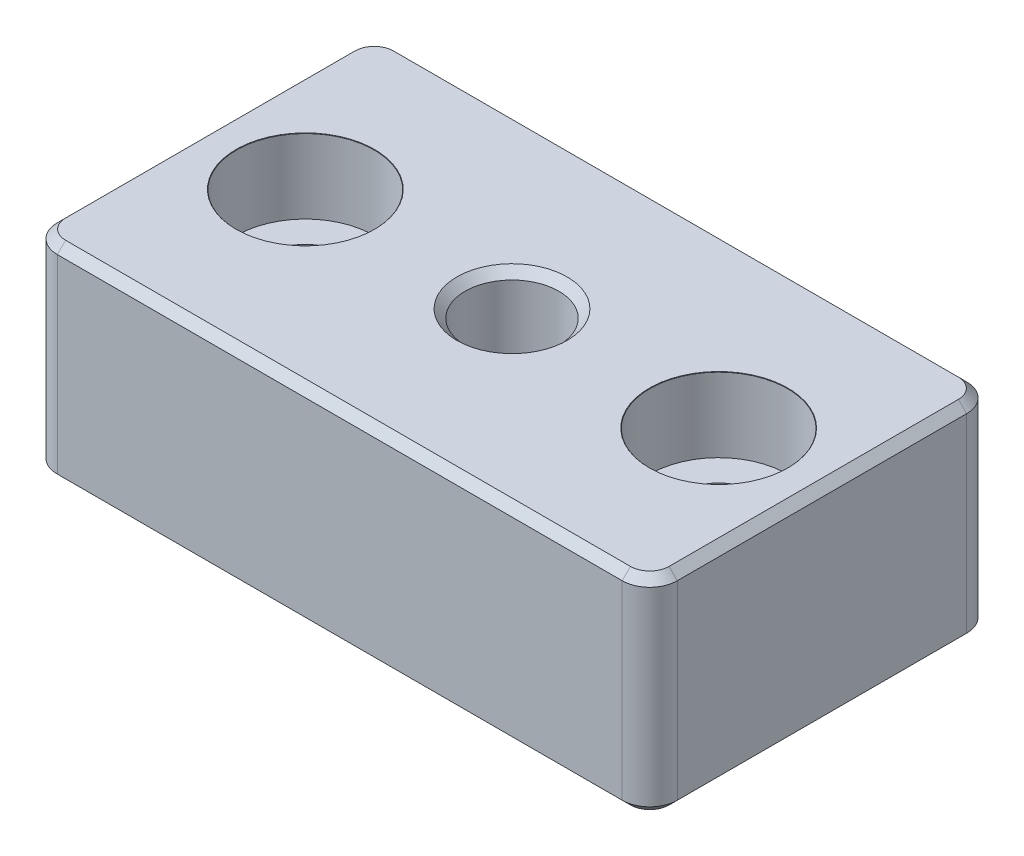
ISO-10303-21;
HEADER;
FILE_DESCRIPTION(('STEP AP214'),'2;1');
FILE_NAME('part.step','',(''),(''),'','','');
FILE_SCHEMA(('AUTOMOTIVE_DESIGN { 1 0 10303 214 1 1 1 1 }'));
ENDSEC;
DATA;
#1=APPLICATION_CONTEXT('core data for automotive mechanical design processes');
#2=APPLICATION_PROTOCOL_DEFINITION('international standard','automotive_design',2000,#1);
#3=PRODUCT_CONTEXT('',#1,'mechanical');
#4=PRODUCT('Part','Part','',(#3));
#5=PRODUCT_RELATED_PRODUCT_CATEGORY('part','',(#4));
#6=PRODUCT_DEFINITION_FORMATION('','',#4);
#7=PRODUCT_DEFINITION_CONTEXT('part definition',#1,'design');
#8=PRODUCT_DEFINITION('design','',#6,#7);
#9=PRODUCT_DEFINITION_SHAPE('','',#8);
#10=(LENGTH_UNIT() NAMED_UNIT(*) SI_UNIT(.MILLI.,.METRE.));
#11=(NAMED_UNIT(*) PLANE_ANGLE_UNIT() SI_UNIT($,.RADIAN.));
#12=(NAMED_UNIT(*) SI_UNIT($,.STERADIAN.) SOLID_ANGLE_UNIT());
#13=UNCERTAINTY_MEASURE_WITH_UNIT(LENGTH_MEASURE(1.E-05),#10,'distance_accuracy_value','');
#14=(GEOMETRIC_REPRESENTATION_CONTEXT(3) GLOBAL_UNCERTAINTY_ASSIGNED_CONTEXT((#13)) GLOBAL_UNIT_ASSIGNED_CONTEXT((#10,
#11,#12)) REPRESENTATION_CONTEXT('',''));
#15=CARTESIAN_POINT('',(0.,0.,0.));
#16=DIRECTION('',(0.,0.,1.));
#17=DIRECTION('',(1.,0.,0.));
#18=AXIS2_PLACEMENT_3D('',#15,#16,#17);
#19=CARTESIAN_POINT('',(-22.5,15.,12.5));
#20=DIRECTION('',(1.,0.,0.));
#21=DIRECTION('',(0.,0.,-1.));
#22=AXIS2_PLACEMENT_3D('',#19,#20,#21);
#23=PLANE('',#22);
#24=DIRECTION('',(0.,-1.,0.));
#25=VECTOR('',#24,1.);
#26=CARTESIAN_POINT('',(-22.5,15.,-10.5));
#27=LINE('',#26,#25);
#28=CARTESIAN_POINT('',(-22.5,14.4,-10.5));
#29=VERTEX_POINT('',#28);
#30=CARTESIAN_POINT('',(-22.5,0.600000000000003,-10.5));
#31=VERTEX_POINT('',#30);
#32=EDGE_CURVE('E363',#29,#31,#27,.T.);
#33=ORIENTED_EDGE('',*,*,#32,.T.);
#34=DIRECTION('',(0.,0.,1.));
#35=VECTOR('',#34,1.);
#36=CARTESIAN_POINT('',(-22.5,0.600000000000003,12.5));
#37=LINE('',#36,#35);
#38=CARTESIAN_POINT('',(-22.5,0.600000000000003,10.5));
#39=VERTEX_POINT('',#38);
#40=EDGE_CURVE('E220',#31,#39,#37,.T.);
#41=ORIENTED_EDGE('',*,*,#40,.T.);
#42=DIRECTION('',(0.,-1.,0.));
#43=VECTOR('',#42,1.);
#44=CARTESIAN_POINT('',(-22.5,15.,10.5));
#45=LINE('',#44,#43);
#46=CARTESIAN_POINT('',(-22.5,14.4,10.5));
#47=VERTEX_POINT('',#46);
#48=EDGE_CURVE('E366',#39,#47,#45,.F.);
#49=ORIENTED_EDGE('',*,*,#48,.T.);
#50=DIRECTION('',(0.,0.,-1.));
#51=VECTOR('',#50,1.);
#52=CARTESIAN_POINT('',(-22.5,14.4,-10.5));
#53=LINE('',#52,#51);
#54=EDGE_CURVE('E218',#47,#29,#53,.T.);
#55=ORIENTED_EDGE('',*,*,#54,.T.);
#56=EDGE_LOOP('',(#33,#41,#49,#55));
#57=FACE_BOUND('',#56,.T.);
#58=ADVANCED_FACE('F39',(#57),#23,.F.);
#59=CARTESIAN_POINT('',(22.5,15.,12.5));
#60=DIRECTION('',(0.,0.,-1.));
#61=DIRECTION('',(-1.,0.,0.));
#62=AXIS2_PLACEMENT_3D('',#59,#60,#61);
#63=PLANE('',#62);
#64=DIRECTION('',(0.,-1.,0.));
#65=VECTOR('',#64,1.);
#66=CARTESIAN_POINT('',(-20.5,15.,12.5));
#67=LINE('',#66,#65);
#68=CARTESIAN_POINT('',(-20.5,14.4,12.5));
#69=VERTEX_POINT('',#68);
#70=CARTESIAN_POINT('',(-20.5,0.600000000000003,12.5));
#71=VERTEX_POINT('',#70);
#72=EDGE_CURVE('E298',#69,#71,#67,.T.);
#73=ORIENTED_EDGE('',*,*,#72,.T.);
#74=DIRECTION('',(1.,0.,0.));
#75=VECTOR('',#74,1.);
#76=CARTESIAN_POINT('',(22.5,0.600000000000003,12.5));
#77=LINE('',#76,#75);
#78=CARTESIAN_POINT('',(20.5,0.600000000000003,12.5));
#79=VERTEX_POINT('',#78);
#80=EDGE_CURVE('E195',#71,#79,#77,.T.);
#81=ORIENTED_EDGE('',*,*,#80,.T.);
#82=DIRECTION('',(0.,-1.,0.));
#83=VECTOR('',#82,1.);
#84=CARTESIAN_POINT('',(20.5,15.,12.5));
#85=LINE('',#84,#83);
#86=CARTESIAN_POINT('',(20.5,14.4,12.5));
#87=VERTEX_POINT('',#86);
#88=EDGE_CURVE('E300',#79,#87,#85,.F.);
#89=ORIENTED_EDGE('',*,*,#88,.T.);
#90=DIRECTION('',(-1.,0.,0.));
#91=VECTOR('',#90,1.);
#92=CARTESIAN_POINT('',(-20.5,14.4,12.5));
#93=LINE('',#92,#91);
#94=EDGE_CURVE('E193',#87,#69,#93,.T.);
#95=ORIENTED_EDGE('',*,*,#94,.T.);
#96=EDGE_LOOP('',(#73,#81,#89,#95));
#97=FACE_BOUND('',#96,.T.);
#98=ADVANCED_FACE('F297',(#97),#63,.F.);
#99=CARTESIAN_POINT('',(22.5,15.,12.5));
#100=DIRECTION('',(-1.,0.,0.));
#101=DIRECTION('',(0.,0.,1.));
#102=AXIS2_PLACEMENT_3D('',#99,#100,#101);
#103=PLANE('',#102);
#104=DIRECTION('',(0.,-1.,0.));
#105=VECTOR('',#104,1.);
#106=CARTESIAN_POINT('',(22.5,15.,10.5));
#107=LINE('',#106,#105);
#108=CARTESIAN_POINT('',(22.5,14.4,10.5));
#109=VERTEX_POINT('',#108);
#110=CARTESIAN_POINT('',(22.5,0.600000000000003,10.5));
#111=VERTEX_POINT('',#110);
#112=EDGE_CURVE('E305',#109,#111,#107,.T.);
#113=ORIENTED_EDGE('',*,*,#112,.T.);
#114=DIRECTION('',(0.,0.,-1.));
#115=VECTOR('',#114,1.);
#116=CARTESIAN_POINT('',(22.5,0.600000000000003,12.5));
#117=LINE('',#116,#115);
#118=CARTESIAN_POINT('',(22.5,0.600000000000003,-10.5));
#119=VERTEX_POINT('',#118);
#120=EDGE_CURVE('E203',#111,#119,#117,.T.);
#121=ORIENTED_EDGE('',*,*,#120,.T.);
#122=DIRECTION('',(0.,-1.,0.));
#123=VECTOR('',#122,1.);
#124=CARTESIAN_POINT('',(22.5,15.,-10.5));
#125=LINE('',#124,#123);
#126=CARTESIAN_POINT('',(22.5,14.4,-10.5));
#127=VERTEX_POINT('',#126);
#128=EDGE_CURVE('E308',#119,#127,#125,.F.);
#129=ORIENTED_EDGE('',*,*,#128,.T.);
#130=DIRECTION('',(0.,0.,1.));
#131=VECTOR('',#130,1.);
#132=CARTESIAN_POINT('',(22.5,14.4,10.5));
#133=LINE('',#132,#131);
#134=EDGE_CURVE('E201',#127,#109,#133,.T.);
#135=ORIENTED_EDGE('',*,*,#134,.T.);
#136=EDGE_LOOP('',(#113,#121,#129,#135));
#137=FACE_BOUND('',#136,.T.);
#138=ADVANCED_FACE('F342',(#137),#103,.F.);
#139=CARTESIAN_POINT('',(22.5,15.,-12.5));
#140=DIRECTION('',(0.,0.,1.));
#141=DIRECTION('',(1.,0.,0.));
#142=AXIS2_PLACEMENT_3D('',#139,#140,#141);
#143=PLANE('',#142);
#144=DIRECTION('',(0.,-1.,0.));
#145=VECTOR('',#144,1.);
#146=CARTESIAN_POINT('',(20.5,15.,-12.5));
#147=LINE('',#146,#145);
#148=CARTESIAN_POINT('',(20.5,14.4,-12.5));
#149=VERTEX_POINT('',#148);
#150=CARTESIAN_POINT('',(20.5,0.600000000000003,-12.5));
#151=VERTEX_POINT('',#150);
#152=EDGE_CURVE('E358',#149,#151,#147,.T.);
#153=ORIENTED_EDGE('',*,*,#152,.T.);
#154=DIRECTION('',(-1.,0.,0.));
#155=VECTOR('',#154,1.);
#156=CARTESIAN_POINT('',(22.5,0.600000000000003,-12.5));
#157=LINE('',#156,#155);
#158=CARTESIAN_POINT('',(-20.5,0.600000000000003,-12.5));
#159=VERTEX_POINT('',#158);
#160=EDGE_CURVE('E212',#151,#159,#157,.T.);
#161=ORIENTED_EDGE('',*,*,#160,.T.);
#162=DIRECTION('',(0.,-1.,0.));
#163=VECTOR('',#162,1.);
#164=CARTESIAN_POINT('',(-20.5,15.,-12.5));
#165=LINE('',#164,#163);
#166=CARTESIAN_POINT('',(-20.5,14.4,-12.5));
#167=VERTEX_POINT('',#166);
#168=EDGE_CURVE('E310',#159,#167,#165,.F.);
#169=ORIENTED_EDGE('',*,*,#168,.T.);
#170=DIRECTION('',(1.,0.,0.));
#171=VECTOR('',#170,1.);
#172=CARTESIAN_POINT('',(20.5,14.4,-12.5));
#173=LINE('',#172,#171);
#174=EDGE_CURVE('E209',#167,#149,#173,.T.);
#175=ORIENTED_EDGE('',*,*,#174,.T.);
#176=EDGE_LOOP('',(#153,#161,#169,#175));
#177=FACE_BOUND('',#176,.T.);
#178=ADVANCED_FACE('F360',(#177),#143,.F.);
#179=CARTESIAN_POINT('',(0.,15.,0.));
#180=DIRECTION('',(0.,1.,0.));
#181=DIRECTION('',(0.,0.,1.));
#182=AXIS2_PLACEMENT_3D('',#179,#180,#181);
#183=PLANE('',#182);
#184=CARTESIAN_POINT('',(0.,15.,0.));
#185=DIRECTION('',(0.,1.,0.));
#186=DIRECTION('',(0.,0.,1.));
#187=AXIS2_PLACEMENT_3D('',#184,#185,#186);
#188=CIRCLE('',#187,4.00000000000001);
#189=CARTESIAN_POINT('',(0.,15.,4.00000000000001));
#190=VERTEX_POINT('',#189);
#191=EDGE_CURVE('E11',#190,#190,#188,.F.);
#192=ORIENTED_EDGE('',*,*,#191,.T.);
#193=EDGE_LOOP('',(#192));
#194=FACE_BOUND('',#193,.T.);
#195=CARTESIAN_POINT('',(20.5,15.,-10.5));
#196=DIRECTION('',(0.,1.,0.));
#197=DIRECTION('',(0.,0.,1.));
#198=AXIS2_PLACEMENT_3D('',#195,#196,#197);
#199=CIRCLE('',#198,1.40000000000001);
#200=CARTESIAN_POINT('',(21.9,15.,-10.5));
#201=VERTEX_POINT('',#200);
#202=CARTESIAN_POINT('',(20.5,15.,-11.9));
#203=VERTEX_POINT('',#202);
#204=EDGE_CURVE('E65',#201,#203,#199,.T.);
#205=ORIENTED_EDGE('',*,*,#204,.T.);
#206=DIRECTION('',(-1.,0.,0.));
#207=VECTOR('',#206,1.);
#208=CARTESIAN_POINT('',(-20.5,15.,-11.9));
#209=LINE('',#208,#207);
#210=CARTESIAN_POINT('',(-20.5,15.,-11.9));
#211=VERTEX_POINT('',#210);
#212=EDGE_CURVE('E49',#203,#211,#209,.T.);
#213=ORIENTED_EDGE('',*,*,#212,.T.);
#214=CARTESIAN_POINT('',(-20.5,15.,-10.5));
#215=DIRECTION('',(0.,1.,0.));
#216=DIRECTION('',(0.,0.,1.));
#217=AXIS2_PLACEMENT_3D('',#214,#215,#216);
#218=CIRCLE('',#217,1.40000000000001);
#219=CARTESIAN_POINT('',(-21.9,15.,-10.5));
#220=VERTEX_POINT('',#219);
#221=EDGE_CURVE('E242',#211,#220,#218,.T.);
#222=ORIENTED_EDGE('',*,*,#221,.T.);
#223=DIRECTION('',(0.,0.,1.));
#224=VECTOR('',#223,1.);
#225=CARTESIAN_POINT('',(-21.9,15.,10.5));
#226=LINE('',#225,#224);
#227=CARTESIAN_POINT('',(-21.9,15.,10.5));
#228=VERTEX_POINT('',#227);
#229=EDGE_CURVE('E239',#220,#228,#226,.T.);
#230=ORIENTED_EDGE('',*,*,#229,.T.);
#231=CARTESIAN_POINT('',(-20.5,15.,10.5));
#232=DIRECTION('',(0.,1.,0.));
#233=DIRECTION('',(0.,0.,1.));
#234=AXIS2_PLACEMENT_3D('',#231,#232,#233);
#235=CIRCLE('',#234,1.40000000000001);
#236=CARTESIAN_POINT('',(-20.5,15.,11.9));
#237=VERTEX_POINT('',#236);
#238=EDGE_CURVE('E235',#228,#237,#235,.T.);
#239=ORIENTED_EDGE('',*,*,#238,.T.);
#240=DIRECTION('',(1.,0.,0.));
#241=VECTOR('',#240,1.);
#242=CARTESIAN_POINT('',(20.5,15.,11.9));
#243=LINE('',#242,#241);
#244=CARTESIAN_POINT('',(20.5,15.,11.9));
#245=VERTEX_POINT('',#244);
#246=EDGE_CURVE('E231',#237,#245,#243,.T.);
#247=ORIENTED_EDGE('',*,*,#246,.T.);
#248=CARTESIAN_POINT('',(20.5,15.,10.5));
#249=DIRECTION('',(0.,1.,0.));
#250=DIRECTION('',(0.,0.,1.));
#251=AXIS2_PLACEMENT_3D('',#248,#249,#250);
#252=CIRCLE('',#251,1.40000000000001);
#253=CARTESIAN_POINT('',(21.9,15.,10.5));
#254=VERTEX_POINT('',#253);
#255=EDGE_CURVE('E233',#245,#254,#252,.T.);
#256=ORIENTED_EDGE('',*,*,#255,.T.);
#257=DIRECTION('',(0.,0.,-1.));
#258=VECTOR('',#257,1.);
#259=CARTESIAN_POINT('',(21.9,15.,-10.5));
#260=LINE('',#259,#258);
#261=EDGE_CURVE('E237',#254,#201,#260,.T.);
#262=ORIENTED_EDGE('',*,*,#261,.T.);
#263=EDGE_LOOP('',(#205,#213,#222,#230,#239,#247,#256,#262));
#264=FACE_BOUND('',#263,.T.);
#265=CARTESIAN_POINT('',(-15.,15.,0.));
#266=DIRECTION('',(0.,1.,0.));
#267=DIRECTION('',(0.,0.,1.));
#268=AXIS2_PLACEMENT_3D('',#265,#266,#267);
#269=CIRCLE('',#268,5.025);
#270=CARTESIAN_POINT('',(-15.,15.,5.025));
#271=VERTEX_POINT('',#270);
#272=EDGE_CURVE('E262',#271,#271,#269,.T.);
#273=ORIENTED_EDGE('',*,*,#272,.F.);
#274=EDGE_LOOP('',(#273));
#275=FACE_BOUND('',#274,.T.);
#276=CARTESIAN_POINT('',(15.,15.,0.));
#277=DIRECTION('',(0.,1.,0.));
#278=DIRECTION('',(0.,0.,1.));
#279=AXIS2_PLACEMENT_3D('',#276,#277,#278);
#280=CIRCLE('',#279,5.025);
#281=CARTESIAN_POINT('',(15.,15.,5.025));
#282=VERTEX_POINT('',#281);
#283=EDGE_CURVE('E382',#282,#282,#280,.T.);
#284=ORIENTED_EDGE('',*,*,#283,.F.);
#285=EDGE_LOOP('',(#284));
#286=FACE_BOUND('',#285,.T.);
#287=ADVANCED_FACE('F399',(#194,#264,#275,#286),#183,.T.);
#288=CARTESIAN_POINT('',(0.,0.,0.));
#289=DIRECTION('',(0.,1.,0.));
#290=DIRECTION('',(0.,0.,1.));
#291=AXIS2_PLACEMENT_3D('',#288,#289,#290);
#292=PLANE('',#291);
#293=DIRECTION('',(-1.,0.,0.));
#294=VECTOR('',#293,1.);
#295=CARTESIAN_POINT('',(0.,0.,11.9));
#296=LINE('',#295,#294);
#297=CARTESIAN_POINT('',(20.5,0.,11.9));
#298=VERTEX_POINT('',#297);
#299=CARTESIAN_POINT('',(-20.5,0.,11.9));
#300=VERTEX_POINT('',#299);
#301=EDGE_CURVE('E183',#298,#300,#296,.T.);
#302=ORIENTED_EDGE('',*,*,#301,.T.);
#303=CARTESIAN_POINT('',(-20.5,0.,10.5));
#304=DIRECTION('',(0.,1.,0.));
#305=DIRECTION('',(0.,0.,1.));
#306=AXIS2_PLACEMENT_3D('',#303,#304,#305);
#307=CIRCLE('',#306,1.4);
#308=CARTESIAN_POINT('',(-21.9,0.,10.5));
#309=VERTEX_POINT('',#308);
#310=EDGE_CURVE('E163',#300,#309,#307,.F.);
#311=ORIENTED_EDGE('',*,*,#310,.T.);
#312=DIRECTION('',(0.,0.,-1.));
#313=VECTOR('',#312,1.);
#314=CARTESIAN_POINT('',(-21.9,0.,0.));
#315=LINE('',#314,#313);
#316=CARTESIAN_POINT('',(-21.9,0.,-10.5));
#317=VERTEX_POINT('',#316);
#318=EDGE_CURVE('E171',#309,#317,#315,.T.);
#319=ORIENTED_EDGE('',*,*,#318,.T.);
#320=CARTESIAN_POINT('',(-20.5,0.,-10.5));
#321=DIRECTION('',(0.,1.,0.));
#322=DIRECTION('',(0.,0.,1.));
#323=AXIS2_PLACEMENT_3D('',#320,#321,#322);
#324=CIRCLE('',#323,1.4);
#325=CARTESIAN_POINT('',(-20.5,0.,-11.9));
#326=VERTEX_POINT('',#325);
#327=EDGE_CURVE('E177',#317,#326,#324,.F.);
#328=ORIENTED_EDGE('',*,*,#327,.T.);
#329=DIRECTION('',(1.,0.,0.));
#330=VECTOR('',#329,1.);
#331=CARTESIAN_POINT('',(0.,0.,-11.9));
#332=LINE('',#331,#330);
#333=CARTESIAN_POINT('',(20.5,0.,-11.9));
#334=VERTEX_POINT('',#333);
#335=EDGE_CURVE('E322',#326,#334,#332,.T.);
#336=ORIENTED_EDGE('',*,*,#335,.T.);
#337=CARTESIAN_POINT('',(20.5,0.,-10.5));
#338=DIRECTION('',(0.,1.,0.));
#339=DIRECTION('',(0.,0.,1.));
#340=AXIS2_PLACEMENT_3D('',#337,#338,#339);
#341=CIRCLE('',#340,1.4);
#342=CARTESIAN_POINT('',(21.9,0.,-10.5));
#343=VERTEX_POINT('',#342);
#344=EDGE_CURVE('E324',#334,#343,#341,.F.);
#345=ORIENTED_EDGE('',*,*,#344,.T.);
#346=DIRECTION('',(0.,0.,1.));
#347=VECTOR('',#346,1.);
#348=CARTESIAN_POINT('',(21.9,0.,0.));
#349=LINE('',#348,#347);
#350=CARTESIAN_POINT('',(21.9,0.,10.5));
#351=VERTEX_POINT('',#350);
#352=EDGE_CURVE('E326',#343,#351,#349,.T.);
#353=ORIENTED_EDGE('',*,*,#352,.T.);
#354=CARTESIAN_POINT('',(20.5,0.,10.5));
#355=DIRECTION('',(0.,1.,0.));
#356=DIRECTION('',(0.,0.,1.));
#357=AXIS2_PLACEMENT_3D('',#354,#355,#356);
#358=CIRCLE('',#357,1.4);
#359=EDGE_CURVE('E188',#351,#298,#358,.F.);
#360=ORIENTED_EDGE('',*,*,#359,.T.);
#361=EDGE_LOOP('',(#302,#311,#319,#328,#336,#345,#353,#360));
#362=FACE_BOUND('',#361,.T.);
#363=CARTESIAN_POINT('',(15.,0.,0.));
#364=DIRECTION('',(0.,1.,0.));
#365=DIRECTION('',(0.,0.,1.));
#366=AXIS2_PLACEMENT_3D('',#363,#364,#365);
#367=CIRCLE('',#366,3.35);
#368=CARTESIAN_POINT('',(15.,0.,3.35));
#369=VERTEX_POINT('',#368);
#370=EDGE_CURVE('E178',#369,#369,#367,.T.);
#371=ORIENTED_EDGE('',*,*,#370,.T.);
#372=EDGE_LOOP('',(#371));
#373=FACE_BOUND('',#372,.T.);
#374=CARTESIAN_POINT('',(-15.,0.,0.));
#375=DIRECTION('',(0.,1.,0.));
#376=DIRECTION('',(0.,0.,1.));
#377=AXIS2_PLACEMENT_3D('',#374,#375,#376);
#378=CIRCLE('',#377,3.35);
#379=CARTESIAN_POINT('',(-15.,0.,3.35));
#380=VERTEX_POINT('',#379);
#381=EDGE_CURVE('E316',#380,#380,#378,.T.);
#382=ORIENTED_EDGE('',*,*,#381,.T.);
#383=EDGE_LOOP('',(#382));
#384=FACE_BOUND('',#383,.T.);
#385=ADVANCED_FACE('F180',(#362,#373,#384),#292,.F.);
#386=CARTESIAN_POINT('',(0.,5.,0.));
#387=DIRECTION('',(0.,-1.,0.));
#388=DIRECTION('',(0.,0.,-1.));
#389=AXIS2_PLACEMENT_3D('',#386,#387,#388);
#390=PLANE('',#389);
#391=CARTESIAN_POINT('',(0.,5.,0.));
#392=DIRECTION('',(0.,1.,0.));
#393=DIRECTION('',(0.,0.,1.));
#394=AXIS2_PLACEMENT_3D('',#391,#392,#393);
#395=CIRCLE('',#394,3.40000000000001);
#396=CARTESIAN_POINT('',(0.,5.,3.40000000000001));
#397=VERTEX_POINT('',#396);
#398=EDGE_CURVE('E370',#397,#397,#395,.T.);
#399=ORIENTED_EDGE('',*,*,#398,.T.);
#400=EDGE_LOOP('',(#399));
#401=FACE_BOUND('',#400,.T.);
#402=ADVANCED_FACE('F666',(#401),#390,.F.);
#403=CARTESIAN_POINT('',(0.,15.,0.));
#404=DIRECTION('',(0.,1.,0.));
#405=DIRECTION('',(0.,0.,1.));
#406=AXIS2_PLACEMENT_3D('',#403,#404,#405);
#407=CYLINDRICAL_SURFACE('',#406,3.40000000000001);
#408=CARTESIAN_POINT('',(0.,14.4,0.));
#409=DIRECTION('',(0.,1.,0.));
#410=DIRECTION('',(0.,0.,1.));
#411=AXIS2_PLACEMENT_3D('',#408,#409,#410);
#412=CIRCLE('',#411,3.40000000000001);
#413=CARTESIAN_POINT('',(0.,14.4,3.40000000000001));
#414=VERTEX_POINT('',#413);
#415=EDGE_CURVE('E228',#414,#414,#412,.T.);
#416=ORIENTED_EDGE('',*,*,#415,.T.);
#417=EDGE_LOOP('',(#416));
#418=FACE_BOUND('',#417,.T.);
#419=ORIENTED_EDGE('',*,*,#398,.F.);
#420=EDGE_LOOP('',(#419));
#421=FACE_BOUND('',#420,.T.);
#422=ADVANCED_FACE('F653',(#418,#421),#407,.F.);
#423=CARTESIAN_POINT('',(15.,15.,0.));
#424=DIRECTION('',(0.,1.,0.));
#425=DIRECTION('',(0.,0.,1.));
#426=AXIS2_PLACEMENT_3D('',#423,#424,#425);
#427=CYLINDRICAL_SURFACE('',#426,2.75);
#428=CARTESIAN_POINT('',(15.,0.600000000000005,0.));
#429=DIRECTION('',(0.,1.,0.));
#430=DIRECTION('',(0.,0.,1.));
#431=AXIS2_PLACEMENT_3D('',#428,#429,#430);
#432=CIRCLE('',#431,2.75);
#433=CARTESIAN_POINT('',(15.,0.600000000000005,2.74999999999999));
#434=VERTEX_POINT('',#433);
#435=EDGE_CURVE('E222',#434,#434,#432,.F.);
#436=ORIENTED_EDGE('',*,*,#435,.T.);
#437=EDGE_LOOP('',(#436));
#438=FACE_BOUND('',#437,.T.);
#439=CARTESIAN_POINT('',(15.,9.6,0.));
#440=DIRECTION('',(0.,1.,0.));
#441=DIRECTION('',(0.,0.,1.));
#442=AXIS2_PLACEMENT_3D('',#439,#440,#441);
#443=CIRCLE('',#442,2.75);
#444=CARTESIAN_POINT('',(15.,9.6,2.75));
#445=VERTEX_POINT('',#444);
#446=EDGE_CURVE('E373',#445,#445,#443,.T.);
#447=ORIENTED_EDGE('',*,*,#446,.T.);
#448=EDGE_LOOP('',(#447));
#449=FACE_BOUND('',#448,.T.);
#450=ADVANCED_FACE('F648',(#438,#449),#427,.F.);
#451=CARTESIAN_POINT('',(20.,9.6,0.));
#452=DIRECTION('',(0.,-1.,0.));
#453=DIRECTION('',(0.,0.,-1.));
#454=AXIS2_PLACEMENT_3D('',#451,#452,#453);
#455=PLANE('',#454);
#456=ORIENTED_EDGE('',*,*,#446,.F.);
#457=EDGE_LOOP('',(#456));
#458=FACE_BOUND('',#457,.T.);
#459=CARTESIAN_POINT('',(15.,9.6,0.));
#460=DIRECTION('',(0.,1.,0.));
#461=DIRECTION('',(0.,0.,1.));
#462=AXIS2_PLACEMENT_3D('',#459,#460,#461);
#463=CIRCLE('',#462,5.);
#464=CARTESIAN_POINT('',(15.,9.6,5.));
#465=VERTEX_POINT('',#464);
#466=EDGE_CURVE('E376',#465,#465,#463,.T.);
#467=ORIENTED_EDGE('',*,*,#466,.T.);
#468=EDGE_LOOP('',(#467));
#469=FACE_BOUND('',#468,.T.);
#470=ADVANCED_FACE('F419',(#458,#469),#455,.F.);
#471=CARTESIAN_POINT('',(15.,15.,0.));
#472=DIRECTION('',(0.,1.,0.));
#473=DIRECTION('',(0.,0.,1.));
#474=AXIS2_PLACEMENT_3D('',#471,#472,#473);
#475=CYLINDRICAL_SURFACE('',#474,5.);
#476=ORIENTED_EDGE('',*,*,#466,.F.);
#477=EDGE_LOOP('',(#476));
#478=FACE_BOUND('',#477,.T.);
#479=CARTESIAN_POINT('',(15.,14.975,0.));
#480=DIRECTION('',(0.,1.,0.));
#481=DIRECTION('',(0.,0.,1.));
#482=AXIS2_PLACEMENT_3D('',#479,#480,#481);
#483=CIRCLE('',#482,5.);
#484=CARTESIAN_POINT('',(15.,14.975,4.99999999999999));
#485=VERTEX_POINT('',#484);
#486=EDGE_CURVE('E379',#485,#485,#483,.T.);
#487=ORIENTED_EDGE('',*,*,#486,.T.);
#488=EDGE_LOOP('',(#487));
#489=FACE_BOUND('',#488,.T.);
#490=ADVANCED_FACE('F409',(#478,#489),#475,.F.);
#491=CARTESIAN_POINT('',(15.,15.,0.));
#492=DIRECTION('',(0.,1.,0.));
#493=DIRECTION('',(0.,0.,1.));
#494=AXIS2_PLACEMENT_3D('',#491,#492,#493);
#495=CONICAL_SURFACE('',#494,5.025,0.785398163397448);
#496=ORIENTED_EDGE('',*,*,#486,.F.);
#497=EDGE_LOOP('',(#496));
#498=FACE_BOUND('',#497,.T.);
#499=ORIENTED_EDGE('',*,*,#283,.T.);
#500=EDGE_LOOP('',(#499));
#501=FACE_BOUND('',#500,.T.);
#502=ADVANCED_FACE('F406',(#498,#501),#495,.F.);
#503=CARTESIAN_POINT('',(-15.,15.,0.));
#504=DIRECTION('',(0.,1.,0.));
#505=DIRECTION('',(0.,0.,1.));
#506=AXIS2_PLACEMENT_3D('',#503,#504,#505);
#507=CYLINDRICAL_SURFACE('',#506,2.75);
#508=CARTESIAN_POINT('',(-15.,0.600000000000005,0.));
#509=DIRECTION('',(0.,1.,0.));
#510=DIRECTION('',(0.,0.,1.));
#511=AXIS2_PLACEMENT_3D('',#508,#509,#510);
#512=CIRCLE('',#511,2.75);
#513=CARTESIAN_POINT('',(-15.,0.600000000000005,2.75));
#514=VERTEX_POINT('',#513);
#515=EDGE_CURVE('E225',#514,#514,#512,.F.);
#516=ORIENTED_EDGE('',*,*,#515,.T.);
#517=EDGE_LOOP('',(#516));
#518=FACE_BOUND('',#517,.T.);
#519=CARTESIAN_POINT('',(-15.,9.6,0.));
#520=DIRECTION('',(0.,1.,0.));
#521=DIRECTION('',(0.,0.,1.));
#522=AXIS2_PLACEMENT_3D('',#519,#520,#521);
#523=CIRCLE('',#522,2.75);
#524=CARTESIAN_POINT('',(-15.,9.6,2.75));
#525=VERTEX_POINT('',#524);
#526=EDGE_CURVE('E385',#525,#525,#523,.T.);
#527=ORIENTED_EDGE('',*,*,#526,.T.);
#528=EDGE_LOOP('',(#527));
#529=FACE_BOUND('',#528,.T.);
#530=ADVANCED_FACE('F408',(#518,#529),#507,.F.);
#531=CARTESIAN_POINT('',(-10.,9.6,0.));
#532=DIRECTION('',(0.,-1.,0.));
#533=DIRECTION('',(0.,0.,-1.));
#534=AXIS2_PLACEMENT_3D('',#531,#532,#533);
#535=PLANE('',#534);
#536=ORIENTED_EDGE('',*,*,#526,.F.);
#537=EDGE_LOOP('',(#536));
#538=FACE_BOUND('',#537,.T.);
#539=CARTESIAN_POINT('',(-15.,9.6,0.));
#540=DIRECTION('',(0.,1.,0.));
#541=DIRECTION('',(0.,0.,1.));
#542=AXIS2_PLACEMENT_3D('',#539,#540,#541);
#543=CIRCLE('',#542,5.);
#544=CARTESIAN_POINT('',(-15.,9.6,5.));
#545=VERTEX_POINT('',#544);
#546=EDGE_CURVE('E388',#545,#545,#543,.T.);
#547=ORIENTED_EDGE('',*,*,#546,.T.);
#548=EDGE_LOOP('',(#547));
#549=FACE_BOUND('',#548,.T.);
#550=ADVANCED_FACE('F416',(#538,#549),#535,.F.);
#551=CARTESIAN_POINT('',(-15.,15.,0.));
#552=DIRECTION('',(0.,1.,0.));
#553=DIRECTION('',(0.,0.,1.));
#554=AXIS2_PLACEMENT_3D('',#551,#552,#553);
#555=CYLINDRICAL_SURFACE('',#554,5.);
#556=ORIENTED_EDGE('',*,*,#546,.F.);
#557=EDGE_LOOP('',(#556));
#558=FACE_BOUND('',#557,.T.);
#559=CARTESIAN_POINT('',(-15.,14.975,0.));
#560=DIRECTION('',(0.,1.,0.));
#561=DIRECTION('',(0.,0.,1.));
#562=AXIS2_PLACEMENT_3D('',#559,#560,#561);
#563=CIRCLE('',#562,5.);
#564=CARTESIAN_POINT('',(-15.,14.975,5.));
#565=VERTEX_POINT('',#564);
#566=EDGE_CURVE('E391',#565,#565,#563,.T.);
#567=ORIENTED_EDGE('',*,*,#566,.T.);
#568=EDGE_LOOP('',(#567));
#569=FACE_BOUND('',#568,.T.);
#570=ADVANCED_FACE('F622',(#558,#569),#555,.F.);
#571=CARTESIAN_POINT('',(-15.,15.,0.));
#572=DIRECTION('',(0.,1.,0.));
#573=DIRECTION('',(0.,0.,1.));
#574=AXIS2_PLACEMENT_3D('',#571,#572,#573);
#575=CONICAL_SURFACE('',#574,5.025,0.785398163397448);
#576=ORIENTED_EDGE('',*,*,#566,.F.);
#577=EDGE_LOOP('',(#576));
#578=FACE_BOUND('',#577,.T.);
#579=ORIENTED_EDGE('',*,*,#272,.T.);
#580=EDGE_LOOP('',(#579));
#581=FACE_BOUND('',#580,.T.);
#582=ADVANCED_FACE('F397',(#578,#581),#575,.F.);
#583=CARTESIAN_POINT('',(-20.5,15.,-10.5));
#584=DIRECTION('',(0.,-1.,0.));
#585=DIRECTION('',(0.,0.,-1.));
#586=AXIS2_PLACEMENT_3D('',#583,#584,#585);
#587=CYLINDRICAL_SURFACE('',#586,2.);
#588=ORIENTED_EDGE('',*,*,#168,.F.);
#589=CARTESIAN_POINT('',(-20.5,0.600000000000003,-10.5));
#590=DIRECTION('',(0.,1.,0.));
#591=DIRECTION('',(0.,0.,1.));
#592=AXIS2_PLACEMENT_3D('',#589,#590,#591);
#593=CIRCLE('',#592,2.);
#594=EDGE_CURVE('E216',#159,#31,#593,.T.);
#595=ORIENTED_EDGE('',*,*,#594,.T.);
#596=ORIENTED_EDGE('',*,*,#32,.F.);
#597=CARTESIAN_POINT('',(-20.5,14.4,-10.5));
#598=DIRECTION('',(0.,1.,0.));
#599=DIRECTION('',(0.,0.,1.));
#600=AXIS2_PLACEMENT_3D('',#597,#598,#599);
#601=CIRCLE('',#600,2.);
#602=EDGE_CURVE('E214',#29,#167,#601,.F.);
#603=ORIENTED_EDGE('',*,*,#602,.T.);
#604=EDGE_LOOP('',(#588,#595,#596,#603));
#605=FACE_BOUND('',#604,.T.);
#606=ADVANCED_FACE('F432',(#605),#587,.T.);
#607=CARTESIAN_POINT('',(-20.5,15.,10.5));
#608=DIRECTION('',(0.,-1.,0.));
#609=DIRECTION('',(0.,0.,-1.));
#610=AXIS2_PLACEMENT_3D('',#607,#608,#609);
#611=CYLINDRICAL_SURFACE('',#610,2.);
#612=ORIENTED_EDGE('',*,*,#48,.F.);
#613=CARTESIAN_POINT('',(-20.5,0.600000000000003,10.5));
#614=DIRECTION('',(0.,1.,0.));
#615=DIRECTION('',(0.,0.,1.));
#616=AXIS2_PLACEMENT_3D('',#613,#614,#615);
#617=CIRCLE('',#616,2.);
#618=EDGE_CURVE('E165',#39,#71,#617,.T.);
#619=ORIENTED_EDGE('',*,*,#618,.T.);
#620=ORIENTED_EDGE('',*,*,#72,.F.);
#621=CARTESIAN_POINT('',(-20.5,14.4,10.5));
#622=DIRECTION('',(0.,1.,0.));
#623=DIRECTION('',(0.,0.,1.));
#624=AXIS2_PLACEMENT_3D('',#621,#622,#623);
#625=CIRCLE('',#624,2.);
#626=EDGE_CURVE('E185',#69,#47,#625,.F.);
#627=ORIENTED_EDGE('',*,*,#626,.T.);
#628=EDGE_LOOP('',(#612,#619,#620,#627));
#629=FACE_BOUND('',#628,.T.);
#630=ADVANCED_FACE('F303',(#629),#611,.T.);
#631=CARTESIAN_POINT('',(20.5,15.,-10.5));
#632=DIRECTION('',(0.,-1.,0.));
#633=DIRECTION('',(0.,0.,-1.));
#634=AXIS2_PLACEMENT_3D('',#631,#632,#633);
#635=CYLINDRICAL_SURFACE('',#634,2.);
#636=ORIENTED_EDGE('',*,*,#128,.F.);
#637=CARTESIAN_POINT('',(20.5,0.600000000000003,-10.5));
#638=DIRECTION('',(0.,1.,0.));
#639=DIRECTION('',(0.,0.,1.));
#640=AXIS2_PLACEMENT_3D('',#637,#638,#639);
#641=CIRCLE('',#640,2.);
#642=EDGE_CURVE('E207',#119,#151,#641,.T.);
#643=ORIENTED_EDGE('',*,*,#642,.T.);
#644=ORIENTED_EDGE('',*,*,#152,.F.);
#645=CARTESIAN_POINT('',(20.5,14.4,-10.5));
#646=DIRECTION('',(0.,1.,0.));
#647=DIRECTION('',(0.,0.,1.));
#648=AXIS2_PLACEMENT_3D('',#645,#646,#647);
#649=CIRCLE('',#648,2.);
#650=EDGE_CURVE('E205',#149,#127,#649,.F.);
#651=ORIENTED_EDGE('',*,*,#650,.T.);
#652=EDGE_LOOP('',(#636,#643,#644,#651));
#653=FACE_BOUND('',#652,.T.);
#654=ADVANCED_FACE('F357',(#653),#635,.T.);
#655=CARTESIAN_POINT('',(20.5,15.,10.5));
#656=DIRECTION('',(0.,-1.,0.));
#657=DIRECTION('',(0.,0.,-1.));
#658=AXIS2_PLACEMENT_3D('',#655,#656,#657);
#659=CYLINDRICAL_SURFACE('',#658,2.);
#660=ORIENTED_EDGE('',*,*,#88,.F.);
#661=CARTESIAN_POINT('',(20.5,0.600000000000003,10.5));
#662=DIRECTION('',(0.,1.,0.));
#663=DIRECTION('',(0.,0.,1.));
#664=AXIS2_PLACEMENT_3D('',#661,#662,#663);
#665=CIRCLE('',#664,2.);
#666=EDGE_CURVE('E199',#79,#111,#665,.T.);
#667=ORIENTED_EDGE('',*,*,#666,.T.);
#668=ORIENTED_EDGE('',*,*,#112,.F.);
#669=CARTESIAN_POINT('',(20.5,14.4,10.5));
#670=DIRECTION('',(0.,1.,0.));
#671=DIRECTION('',(0.,0.,1.));
#672=AXIS2_PLACEMENT_3D('',#669,#670,#671);
#673=CIRCLE('',#672,2.);
#674=EDGE_CURVE('E197',#109,#87,#673,.F.);
#675=ORIENTED_EDGE('',*,*,#674,.T.);
#676=EDGE_LOOP('',(#660,#667,#668,#675));
#677=FACE_BOUND('',#676,.T.);
#678=ADVANCED_FACE('F338',(#677),#659,.T.);
#679=CARTESIAN_POINT('',(20.5,0.,-10.5));
#680=DIRECTION('',(0.,1.,0.));
#681=DIRECTION('',(0.,0.,1.));
#682=AXIS2_PLACEMENT_3D('',#679,#680,#681);
#683=CONICAL_SURFACE('',#682,1.4,0.785398163397447);
#684=DIRECTION('',(0.,-0.707106781186549,0.707106781186547));
#685=VECTOR('',#684,1.);
#686=CARTESIAN_POINT('',(20.5,0.600000000000003,-12.5));
#687=LINE('',#686,#685);
#688=EDGE_CURVE('E256',#151,#334,#687,.T.);
#689=ORIENTED_EDGE('',*,*,#688,.F.);
#690=ORIENTED_EDGE('',*,*,#642,.F.);
#691=DIRECTION('',(0.707106781186548,0.707106781186548,0.));
#692=VECTOR('',#691,1.);
#693=CARTESIAN_POINT('',(21.9,0.,-10.5));
#694=LINE('',#693,#692);
#695=EDGE_CURVE('E259',#343,#119,#694,.T.);
#696=ORIENTED_EDGE('',*,*,#695,.F.);
#697=ORIENTED_EDGE('',*,*,#344,.F.);
#698=EDGE_LOOP('',(#689,#690,#696,#697));
#699=FACE_BOUND('',#698,.T.);
#700=ADVANCED_FACE('F352',(#699),#683,.T.);
#701=CARTESIAN_POINT('',(22.5,0.600000000000003,12.5));
#702=DIRECTION('',(-0.707106781186548,0.707106781186548,0.));
#703=DIRECTION('',(0.,0.,-1.));
#704=AXIS2_PLACEMENT_3D('',#701,#702,#703);
#705=PLANE('',#704);
#706=ORIENTED_EDGE('',*,*,#695,.T.);
#707=ORIENTED_EDGE('',*,*,#120,.F.);
#708=DIRECTION('',(0.707106781186548,0.707106781186548,0.));
#709=VECTOR('',#708,1.);
#710=CARTESIAN_POINT('',(21.9,0.,10.5));
#711=LINE('',#710,#709);
#712=EDGE_CURVE('E253',#351,#111,#711,.T.);
#713=ORIENTED_EDGE('',*,*,#712,.F.);
#714=ORIENTED_EDGE('',*,*,#352,.F.);
#715=EDGE_LOOP('',(#706,#707,#713,#714));
#716=FACE_BOUND('',#715,.T.);
#717=ADVANCED_FACE('F346',(#716),#705,.F.);
#718=CARTESIAN_POINT('',(22.5,0.600000000000003,-12.5));
#719=DIRECTION('',(0.,0.707106781186547,0.707106781186548));
#720=DIRECTION('',(-1.,0.,0.));
#721=AXIS2_PLACEMENT_3D('',#718,#719,#720);
#722=PLANE('',#721);
#723=ORIENTED_EDGE('',*,*,#688,.T.);
#724=ORIENTED_EDGE('',*,*,#335,.F.);
#725=DIRECTION('',(0.,-0.707106781186548,0.707106781186548));
#726=VECTOR('',#725,1.);
#727=CARTESIAN_POINT('',(-20.5,0.600000000000003,-12.5));
#728=LINE('',#727,#726);
#729=EDGE_CURVE('E250',#159,#326,#728,.T.);
#730=ORIENTED_EDGE('',*,*,#729,.F.);
#731=ORIENTED_EDGE('',*,*,#160,.F.);
#732=EDGE_LOOP('',(#723,#724,#730,#731));
#733=FACE_BOUND('',#732,.T.);
#734=ADVANCED_FACE('F472',(#733),#722,.F.);
#735=CARTESIAN_POINT('',(20.5,0.,10.5));
#736=DIRECTION('',(0.,1.,0.));
#737=DIRECTION('',(0.,0.,1.));
#738=AXIS2_PLACEMENT_3D('',#735,#736,#737);
#739=CONICAL_SURFACE('',#738,1.4,0.785398163397448);
#740=ORIENTED_EDGE('',*,*,#712,.T.);
#741=ORIENTED_EDGE('',*,*,#666,.F.);
#742=DIRECTION('',(0.,0.707106781186548,0.707106781186548));
#743=VECTOR('',#742,1.);
#744=CARTESIAN_POINT('',(20.5,0.,11.9));
#745=LINE('',#744,#743);
#746=EDGE_CURVE('E247',#298,#79,#745,.T.);
#747=ORIENTED_EDGE('',*,*,#746,.F.);
#748=ORIENTED_EDGE('',*,*,#359,.F.);
#749=EDGE_LOOP('',(#740,#741,#747,#748));
#750=FACE_BOUND('',#749,.T.);
#751=ADVANCED_FACE('F333',(#750),#739,.T.);
#752=CARTESIAN_POINT('',(-20.5,0.,-10.5));
#753=DIRECTION('',(0.,1.,0.));
#754=DIRECTION('',(0.,0.,1.));
#755=AXIS2_PLACEMENT_3D('',#752,#753,#754);
#756=CONICAL_SURFACE('',#755,1.4,0.785398163397448);
#757=ORIENTED_EDGE('',*,*,#729,.T.);
#758=ORIENTED_EDGE('',*,*,#327,.F.);
#759=DIRECTION('',(0.707106781186548,-0.707106781186548,0.));
#760=VECTOR('',#759,1.);
#761=CARTESIAN_POINT('',(-22.5,0.600000000000003,-10.5));
#762=LINE('',#761,#760);
#763=EDGE_CURVE('E174',#31,#317,#762,.T.);
#764=ORIENTED_EDGE('',*,*,#763,.F.);
#765=ORIENTED_EDGE('',*,*,#594,.F.);
#766=EDGE_LOOP('',(#757,#758,#764,#765));
#767=FACE_BOUND('',#766,.T.);
#768=ADVANCED_FACE('F460',(#767),#756,.T.);
#769=CARTESIAN_POINT('',(22.5,0.600000000000003,12.5));
#770=DIRECTION('',(0.,0.707106781186548,-0.707106781186547));
#771=DIRECTION('',(1.,0.,0.));
#772=AXIS2_PLACEMENT_3D('',#769,#770,#771);
#773=PLANE('',#772);
#774=ORIENTED_EDGE('',*,*,#746,.T.);
#775=ORIENTED_EDGE('',*,*,#80,.F.);
#776=DIRECTION('',(0.,0.707106781186547,0.707106781186549));
#777=VECTOR('',#776,1.);
#778=CARTESIAN_POINT('',(-20.5,0.,11.9));
#779=LINE('',#778,#777);
#780=EDGE_CURVE('E168',#300,#71,#779,.T.);
#781=ORIENTED_EDGE('',*,*,#780,.F.);
#782=ORIENTED_EDGE('',*,*,#301,.F.);
#783=EDGE_LOOP('',(#774,#775,#781,#782));
#784=FACE_BOUND('',#783,.T.);
#785=ADVANCED_FACE('F336',(#784),#773,.F.);
#786=CARTESIAN_POINT('',(-22.5,0.600000000000003,12.5));
#787=DIRECTION('',(0.707106781186548,0.707106781186548,0.));
#788=DIRECTION('',(0.,0.,1.));
#789=AXIS2_PLACEMENT_3D('',#786,#787,#788);
#790=PLANE('',#789);
#791=ORIENTED_EDGE('',*,*,#763,.T.);
#792=ORIENTED_EDGE('',*,*,#318,.F.);
#793=DIRECTION('',(0.707106781186548,-0.707106781186548,0.));
#794=VECTOR('',#793,1.);
#795=CARTESIAN_POINT('',(-22.5,0.600000000000003,10.5));
#796=LINE('',#795,#794);
#797=EDGE_CURVE('E159',#39,#309,#796,.T.);
#798=ORIENTED_EDGE('',*,*,#797,.F.);
#799=ORIENTED_EDGE('',*,*,#40,.F.);
#800=EDGE_LOOP('',(#791,#792,#798,#799));
#801=FACE_BOUND('',#800,.T.);
#802=ADVANCED_FACE('F172',(#801),#790,.F.);
#803=CARTESIAN_POINT('',(-20.5,0.,10.5));
#804=DIRECTION('',(0.,1.,0.));
#805=DIRECTION('',(0.,0.,1.));
#806=AXIS2_PLACEMENT_3D('',#803,#804,#805);
#807=CONICAL_SURFACE('',#806,1.4,0.785398163397447);
#808=ORIENTED_EDGE('',*,*,#780,.T.);
#809=ORIENTED_EDGE('',*,*,#618,.F.);
#810=ORIENTED_EDGE('',*,*,#797,.T.);
#811=ORIENTED_EDGE('',*,*,#310,.F.);
#812=EDGE_LOOP('',(#808,#809,#810,#811));
#813=FACE_BOUND('',#812,.T.);
#814=ADVANCED_FACE('F161',(#813),#807,.T.);
#815=CARTESIAN_POINT('',(15.,0.,0.));
#816=DIRECTION('',(0.,-1.,0.));
#817=DIRECTION('',(0.,0.,-1.));
#818=AXIS2_PLACEMENT_3D('',#815,#816,#817);
#819=CONICAL_SURFACE('',#818,3.35,0.785398163397446);
#820=ORIENTED_EDGE('',*,*,#435,.F.);
#821=EDGE_LOOP('',(#820));
#822=FACE_BOUND('',#821,.T.);
#823=ORIENTED_EDGE('',*,*,#370,.F.);
#824=EDGE_LOOP('',(#823));
#825=FACE_BOUND('',#824,.T.);
#826=ADVANCED_FACE('F449',(#822,#825),#819,.F.);
#827=CARTESIAN_POINT('',(-15.,0.,0.));
#828=DIRECTION('',(0.,-1.,0.));
#829=DIRECTION('',(0.,0.,-1.));
#830=AXIS2_PLACEMENT_3D('',#827,#828,#829);
#831=CONICAL_SURFACE('',#830,3.35,0.785398163397446);
#832=ORIENTED_EDGE('',*,*,#515,.F.);
#833=EDGE_LOOP('',(#832));
#834=FACE_BOUND('',#833,.T.);
#835=ORIENTED_EDGE('',*,*,#381,.F.);
#836=EDGE_LOOP('',(#835));
#837=FACE_BOUND('',#836,.T.);
#838=ADVANCED_FACE('F493',(#834,#837),#831,.F.);
#839=CARTESIAN_POINT('',(0.,14.4,0.));
#840=DIRECTION('',(0.,1.,0.));
#841=DIRECTION('',(0.,0.,1.));
#842=AXIS2_PLACEMENT_3D('',#839,#840,#841);
#843=CONICAL_SURFACE('',#842,3.40000000000001,0.785398163397454);
#844=ORIENTED_EDGE('',*,*,#191,.F.);
#845=EDGE_LOOP('',(#844));
#846=FACE_BOUND('',#845,.T.);
#847=ORIENTED_EDGE('',*,*,#415,.F.);
#848=EDGE_LOOP('',(#847));
#849=FACE_BOUND('',#848,.T.);
#850=ADVANCED_FACE('F500',(#846,#849),#843,.F.);
#851=CARTESIAN_POINT('',(0.,15.,11.9));
#852=DIRECTION('',(0.,0.707106781186548,0.707106781186547));
#853=DIRECTION('',(-1.,0.,0.));
#854=AXIS2_PLACEMENT_3D('',#851,#852,#853);
#855=PLANE('',#854);
#856=DIRECTION('',(0.,0.707106781186547,-0.707106781186547));
#857=VECTOR('',#856,1.);
#858=CARTESIAN_POINT('',(-20.5,14.4,12.5));
#859=LINE('',#858,#857);
#860=EDGE_CURVE('E277',#69,#237,#859,.T.);
#861=ORIENTED_EDGE('',*,*,#860,.F.);
#862=ORIENTED_EDGE('',*,*,#94,.F.);
#863=DIRECTION('',(0.,-0.707106781186547,0.707106781186547));
#864=VECTOR('',#863,1.);
#865=CARTESIAN_POINT('',(20.5,15.,11.9));
#866=LINE('',#865,#864);
#867=EDGE_CURVE('E44',#245,#87,#866,.T.);
#868=ORIENTED_EDGE('',*,*,#867,.F.);
#869=ORIENTED_EDGE('',*,*,#246,.F.);
#870=EDGE_LOOP('',(#861,#862,#868,#869));
#871=FACE_BOUND('',#870,.T.);
#872=ADVANCED_FACE('F42',(#871),#855,.T.);
#873=CARTESIAN_POINT('',(20.5,15.,10.5));
#874=DIRECTION('',(0.,-1.,0.));
#875=DIRECTION('',(0.,0.,-1.));
#876=AXIS2_PLACEMENT_3D('',#873,#874,#875);
#877=CONICAL_SURFACE('',#876,1.4,0.785398163397448);
#878=ORIENTED_EDGE('',*,*,#867,.T.);
#879=ORIENTED_EDGE('',*,*,#674,.F.);
#880=DIRECTION('',(0.707106781186547,-0.707106781186547,0.));
#881=VECTOR('',#880,1.);
#882=CARTESIAN_POINT('',(21.9,15.,10.5));
#883=LINE('',#882,#881);
#884=EDGE_CURVE('E275',#254,#109,#883,.T.);
#885=ORIENTED_EDGE('',*,*,#884,.F.);
#886=ORIENTED_EDGE('',*,*,#255,.F.);
#887=EDGE_LOOP('',(#878,#879,#885,#886));
#888=FACE_BOUND('',#887,.T.);
#889=ADVANCED_FACE('F288',(#888),#877,.T.);
#890=CARTESIAN_POINT('',(-20.5,15.,10.5));
#891=DIRECTION('',(0.,-1.,0.));
#892=DIRECTION('',(0.,0.,-1.));
#893=AXIS2_PLACEMENT_3D('',#890,#891,#892);
#894=CONICAL_SURFACE('',#893,1.40000000000001,0.785398163397447);
#895=ORIENTED_EDGE('',*,*,#860,.T.);
#896=ORIENTED_EDGE('',*,*,#238,.F.);
#897=DIRECTION('',(0.707106781186547,0.707106781186547,0.));
#898=VECTOR('',#897,1.);
#899=CARTESIAN_POINT('',(-22.5,14.4,10.5));
#900=LINE('',#899,#898);
#901=EDGE_CURVE('E272',#47,#228,#900,.T.);
#902=ORIENTED_EDGE('',*,*,#901,.F.);
#903=ORIENTED_EDGE('',*,*,#626,.F.);
#904=EDGE_LOOP('',(#895,#896,#902,#903));
#905=FACE_BOUND('',#904,.T.);
#906=ADVANCED_FACE('F541',(#905),#894,.T.);
#907=CARTESIAN_POINT('',(21.9,15.,0.));
#908=DIRECTION('',(0.707106781186547,0.707106781186547,0.));
#909=DIRECTION('',(0.,0.,1.));
#910=AXIS2_PLACEMENT_3D('',#907,#908,#909);
#911=PLANE('',#910);
#912=ORIENTED_EDGE('',*,*,#884,.T.);
#913=ORIENTED_EDGE('',*,*,#134,.F.);
#914=DIRECTION('',(0.707106781186547,-0.707106781186547,0.));
#915=VECTOR('',#914,1.);
#916=CARTESIAN_POINT('',(21.9,15.,-10.5));
#917=LINE('',#916,#915);
#918=EDGE_CURVE('E269',#201,#127,#917,.T.);
#919=ORIENTED_EDGE('',*,*,#918,.F.);
#920=ORIENTED_EDGE('',*,*,#261,.F.);
#921=EDGE_LOOP('',(#912,#913,#919,#920));
#922=FACE_BOUND('',#921,.T.);
#923=ADVANCED_FACE('F534',(#922),#911,.T.);
#924=CARTESIAN_POINT('',(-21.9,15.,0.));
#925=DIRECTION('',(-0.707106781186547,0.707106781186547,0.));
#926=DIRECTION('',(0.,0.,-1.));
#927=AXIS2_PLACEMENT_3D('',#924,#925,#926);
#928=PLANE('',#927);
#929=ORIENTED_EDGE('',*,*,#901,.T.);
#930=ORIENTED_EDGE('',*,*,#229,.F.);
#931=DIRECTION('',(0.707106781186547,0.707106781186547,0.));
#932=VECTOR('',#931,1.);
#933=CARTESIAN_POINT('',(-22.5,14.4,-10.5));
#934=LINE('',#933,#932);
#935=EDGE_CURVE('E266',#29,#220,#934,.T.);
#936=ORIENTED_EDGE('',*,*,#935,.F.);
#937=ORIENTED_EDGE('',*,*,#54,.F.);
#938=EDGE_LOOP('',(#929,#930,#936,#937));
#939=FACE_BOUND('',#938,.T.);
#940=ADVANCED_FACE('F527',(#939),#928,.T.);
#941=CARTESIAN_POINT('',(20.5,15.,-10.5));
#942=DIRECTION('',(0.,-1.,0.));
#943=DIRECTION('',(0.,0.,-1.));
#944=AXIS2_PLACEMENT_3D('',#941,#942,#943);
#945=CONICAL_SURFACE('',#944,1.40000000000001,0.785398163397447);
#946=ORIENTED_EDGE('',*,*,#918,.T.);
#947=ORIENTED_EDGE('',*,*,#650,.F.);
#948=DIRECTION('',(0.,-0.707106781186548,-0.707106781186546));
#949=VECTOR('',#948,1.);
#950=CARTESIAN_POINT('',(20.5,15.,-11.9));
#951=LINE('',#950,#949);
#952=EDGE_CURVE('E264',#203,#149,#951,.T.);
#953=ORIENTED_EDGE('',*,*,#952,.F.);
#954=ORIENTED_EDGE('',*,*,#204,.F.);
#955=EDGE_LOOP('',(#946,#947,#953,#954));
#956=FACE_BOUND('',#955,.T.);
#957=ADVANCED_FACE('F520',(#956),#945,.T.);
#958=CARTESIAN_POINT('',(-20.5,15.,-10.5));
#959=DIRECTION('',(0.,-1.,0.));
#960=DIRECTION('',(0.,0.,-1.));
#961=AXIS2_PLACEMENT_3D('',#958,#959,#960);
#962=CONICAL_SURFACE('',#961,1.4,0.785398163397448);
#963=ORIENTED_EDGE('',*,*,#935,.T.);
#964=ORIENTED_EDGE('',*,*,#221,.F.);
#965=DIRECTION('',(0.,0.707106781186548,0.707106781186546));
#966=VECTOR('',#965,1.);
#967=CARTESIAN_POINT('',(-20.5,14.4,-12.5));
#968=LINE('',#967,#966);
#969=EDGE_CURVE('E57',#167,#211,#968,.T.);
#970=ORIENTED_EDGE('',*,*,#969,.F.);
#971=ORIENTED_EDGE('',*,*,#602,.F.);
#972=EDGE_LOOP('',(#963,#964,#970,#971));
#973=FACE_BOUND('',#972,.T.);
#974=ADVANCED_FACE('F514',(#973),#962,.T.);
#975=CARTESIAN_POINT('',(0.,15.,-11.9));
#976=DIRECTION('',(0.,0.707106781186547,-0.707106781186548));
#977=DIRECTION('',(1.,0.,0.));
#978=AXIS2_PLACEMENT_3D('',#975,#976,#977);
#979=PLANE('',#978);
#980=ORIENTED_EDGE('',*,*,#952,.T.);
#981=ORIENTED_EDGE('',*,*,#174,.F.);
#982=ORIENTED_EDGE('',*,*,#969,.T.);
#983=ORIENTED_EDGE('',*,*,#212,.F.);
#984=EDGE_LOOP('',(#980,#981,#982,#983));
#985=FACE_BOUND('',#984,.T.);
#986=ADVANCED_FACE('F508',(#985),#979,.T.);
#987=CLOSED_SHELL('',(#58,#98,#138,#178,#287,#385,#402,#422,#450,#470,#490,#502,#530,#550,#570,
#582,#606,#630,#654,#678,#700,#717,#734,#751,#768,#785,#802,#814,#826,#838,#850,#872,#889,#906,
#923,#940,#957,#974,#986));
#988=MANIFOLD_SOLID_BREP('B2',#987);
#989=ADVANCED_BREP_SHAPE_REPRESENTATION('',(#18,#988),#14);
#990=SHAPE_DEFINITION_REPRESENTATION(#9,#989);
ENDSEC;
END-ISO-10303-21;
